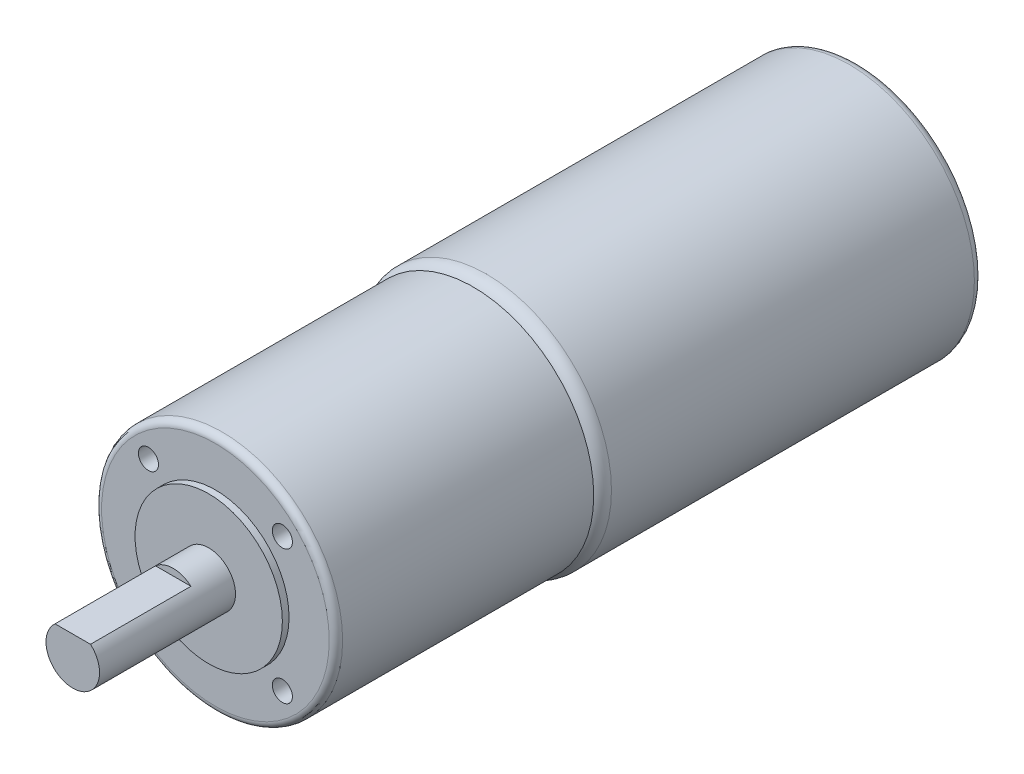
ISO-10303-21;
HEADER;
FILE_DESCRIPTION(('STEP AP214'),'2;1');
FILE_NAME('part.step','',(''),(''),'','','');
FILE_SCHEMA(('AUTOMOTIVE_DESIGN { 1 0 10303 214 1 1 1 1 }'));
ENDSEC;
DATA;
#1=APPLICATION_CONTEXT('core data for automotive mechanical design processes');
#2=APPLICATION_PROTOCOL_DEFINITION('international standard','automotive_design',2000,#1);
#3=PRODUCT_CONTEXT('',#1,'mechanical');
#4=PRODUCT('Part','Part','',(#3));
#5=PRODUCT_RELATED_PRODUCT_CATEGORY('part','',(#4));
#6=PRODUCT_DEFINITION_FORMATION('','',#4);
#7=PRODUCT_DEFINITION_CONTEXT('part definition',#1,'design');
#8=PRODUCT_DEFINITION('design','',#6,#7);
#9=PRODUCT_DEFINITION_SHAPE('','',#8);
#10=(LENGTH_UNIT() NAMED_UNIT(*) SI_UNIT(.MILLI.,.METRE.));
#11=(NAMED_UNIT(*) PLANE_ANGLE_UNIT() SI_UNIT($,.RADIAN.));
#12=(NAMED_UNIT(*) SI_UNIT($,.STERADIAN.) SOLID_ANGLE_UNIT());
#13=UNCERTAINTY_MEASURE_WITH_UNIT(LENGTH_MEASURE(1.E-05),#10,'distance_accuracy_value','');
#14=(GEOMETRIC_REPRESENTATION_CONTEXT(3) GLOBAL_UNCERTAINTY_ASSIGNED_CONTEXT((#13)) GLOBAL_UNIT_ASSIGNED_CONTEXT((#10,
#11,#12)) REPRESENTATION_CONTEXT('',''));
#15=CARTESIAN_POINT('',(0.,0.,0.));
#16=DIRECTION('',(0.,0.,1.));
#17=DIRECTION('',(1.,0.,0.));
#18=AXIS2_PLACEMENT_3D('',#15,#16,#17);
#19=CARTESIAN_POINT('',(0.,0.,38.5));
#20=DIRECTION('',(0.,0.,1.));
#21=DIRECTION('',(1.,0.,0.));
#22=AXIS2_PLACEMENT_3D('',#19,#20,#21);
#23=PLANE('',#22);
#24=CARTESIAN_POINT('',(0.,0.,38.5));
#25=DIRECTION('',(0.,0.,1.));
#26=DIRECTION('',(1.,0.,0.));
#27=AXIS2_PLACEMENT_3D('',#24,#25,#26);
#28=CIRCLE('',#27,11.);
#29=CARTESIAN_POINT('',(11.,0.,38.5));
#30=VERTEX_POINT('',#29);
#31=EDGE_CURVE('E388',#30,#30,#28,.T.);
#32=ORIENTED_EDGE('',*,*,#31,.F.);
#33=EDGE_LOOP('',(#32));
#34=FACE_BOUND('',#33,.T.);
#35=CARTESIAN_POINT('',(0.,0.,38.5));
#36=DIRECTION('',(0.,0.,1.));
#37=DIRECTION('',(1.,0.,0.));
#38=AXIS2_PLACEMENT_3D('',#35,#36,#37);
#39=CIRCLE('',#38,17.);
#40=CARTESIAN_POINT('',(17.,0.,38.5));
#41=VERTEX_POINT('',#40);
#42=EDGE_CURVE('E51',#41,#41,#39,.T.);
#43=ORIENTED_EDGE('',*,*,#42,.T.);
#44=EDGE_LOOP('',(#43));
#45=FACE_BOUND('',#44,.T.);
#46=CARTESIAN_POINT('',(10.,-10.,38.5));
#47=DIRECTION('',(0.,0.,1.));
#48=DIRECTION('',(1.,0.,0.));
#49=AXIS2_PLACEMENT_3D('',#46,#47,#48);
#50=CIRCLE('',#49,1.5);
#51=CARTESIAN_POINT('',(11.5,-10.,38.5));
#52=VERTEX_POINT('',#51);
#53=EDGE_CURVE('E113',#52,#52,#50,.T.);
#54=ORIENTED_EDGE('',*,*,#53,.F.);
#55=EDGE_LOOP('',(#54));
#56=FACE_BOUND('',#55,.T.);
#57=CARTESIAN_POINT('',(-10.,10.,38.5));
#58=DIRECTION('',(0.,0.,1.));
#59=DIRECTION('',(1.,0.,0.));
#60=AXIS2_PLACEMENT_3D('',#57,#58,#59);
#61=CIRCLE('',#60,1.5);
#62=CARTESIAN_POINT('',(-8.5,10.,38.5));
#63=VERTEX_POINT('',#62);
#64=EDGE_CURVE('E129',#63,#63,#61,.T.);
#65=ORIENTED_EDGE('',*,*,#64,.F.);
#66=EDGE_LOOP('',(#65));
#67=FACE_BOUND('',#66,.T.);
#68=CARTESIAN_POINT('',(10.,10.,38.5));
#69=DIRECTION('',(0.,0.,1.));
#70=DIRECTION('',(1.,0.,0.));
#71=AXIS2_PLACEMENT_3D('',#68,#69,#70);
#72=CIRCLE('',#71,1.5);
#73=CARTESIAN_POINT('',(11.5,10.,38.5));
#74=VERTEX_POINT('',#73);
#75=EDGE_CURVE('E121',#74,#74,#72,.T.);
#76=ORIENTED_EDGE('',*,*,#75,.F.);
#77=EDGE_LOOP('',(#76));
#78=FACE_BOUND('',#77,.T.);
#79=CARTESIAN_POINT('',(-9.99999999999999,-10.,38.5));
#80=DIRECTION('',(0.,0.,1.));
#81=DIRECTION('',(1.,0.,0.));
#82=AXIS2_PLACEMENT_3D('',#79,#80,#81);
#83=CIRCLE('',#82,1.5);
#84=CARTESIAN_POINT('',(-8.49999999999999,-10.,38.5));
#85=VERTEX_POINT('',#84);
#86=EDGE_CURVE('E105',#85,#85,#83,.T.);
#87=ORIENTED_EDGE('',*,*,#86,.F.);
#88=EDGE_LOOP('',(#87));
#89=FACE_BOUND('',#88,.T.);
#90=ADVANCED_FACE('F41',(#34,#45,#56,#67,#78,#89),#23,.T.);
#91=CARTESIAN_POINT('',(0.,0.,0.));
#92=DIRECTION('',(0.,0.,1.));
#93=DIRECTION('',(1.,0.,0.));
#94=AXIS2_PLACEMENT_3D('',#91,#92,#93);
#95=PLANE('',#94);
#96=CARTESIAN_POINT('',(0.,0.,0.));
#97=DIRECTION('',(0.,0.,1.));
#98=DIRECTION('',(1.,0.,0.));
#99=AXIS2_PLACEMENT_3D('',#96,#97,#98);
#100=CIRCLE('',#99,16.65);
#101=CARTESIAN_POINT('',(16.65,0.,0.));
#102=VERTEX_POINT('',#101);
#103=EDGE_CURVE('E100',#102,#102,#100,.T.);
#104=ORIENTED_EDGE('',*,*,#103,.T.);
#105=EDGE_LOOP('',(#104));
#106=FACE_BOUND('',#105,.T.);
#107=CARTESIAN_POINT('',(0.,0.,0.));
#108=DIRECTION('',(0.,0.,1.));
#109=DIRECTION('',(1.,0.,0.));
#110=AXIS2_PLACEMENT_3D('',#107,#108,#109);
#111=CIRCLE('',#110,18.);
#112=CARTESIAN_POINT('',(18.,0.,0.));
#113=VERTEX_POINT('',#112);
#114=EDGE_CURVE('E133',#113,#113,#111,.T.);
#115=ORIENTED_EDGE('',*,*,#114,.F.);
#116=EDGE_LOOP('',(#115));
#117=FACE_BOUND('',#116,.T.);
#118=ADVANCED_FACE('F163',(#106,#117),#95,.F.);
#119=CARTESIAN_POINT('',(0.,0.,38.5));
#120=DIRECTION('',(0.,0.,-1.));
#121=DIRECTION('',(-1.,0.,0.));
#122=AXIS2_PLACEMENT_3D('',#119,#120,#121);
#123=CYLINDRICAL_SURFACE('',#122,18.);
#124=CARTESIAN_POINT('',(0.,0.,37.5));
#125=DIRECTION('',(0.,0.,1.));
#126=DIRECTION('',(1.,0.,0.));
#127=AXIS2_PLACEMENT_3D('',#124,#125,#126);
#128=CIRCLE('',#127,18.);
#129=CARTESIAN_POINT('',(18.,0.,37.5));
#130=VERTEX_POINT('',#129);
#131=EDGE_CURVE('E11',#130,#130,#128,.F.);
#132=ORIENTED_EDGE('',*,*,#131,.T.);
#133=EDGE_LOOP('',(#132));
#134=FACE_BOUND('',#133,.T.);
#135=ORIENTED_EDGE('',*,*,#114,.T.);
#136=EDGE_LOOP('',(#135));
#137=FACE_BOUND('',#136,.T.);
#138=ADVANCED_FACE('F170',(#134,#137),#123,.T.);
#139=CARTESIAN_POINT('',(-10.,10.,38.5));
#140=DIRECTION('',(0.,0.,-1.));
#141=DIRECTION('',(-1.,0.,0.));
#142=AXIS2_PLACEMENT_3D('',#139,#140,#141);
#143=CYLINDRICAL_SURFACE('',#142,1.5);
#144=ORIENTED_EDGE('',*,*,#64,.T.);
#145=EDGE_LOOP('',(#144));
#146=FACE_BOUND('',#145,.T.);
#147=CARTESIAN_POINT('',(-10.,10.,0.));
#148=DIRECTION('',(0.,0.,1.));
#149=DIRECTION('',(1.,0.,0.));
#150=AXIS2_PLACEMENT_3D('',#147,#148,#149);
#151=CIRCLE('',#150,1.5);
#152=CARTESIAN_POINT('',(-8.5,10.,0.));
#153=VERTEX_POINT('',#152);
#154=EDGE_CURVE('E125',#153,#153,#151,.T.);
#155=ORIENTED_EDGE('',*,*,#154,.F.);
#156=EDGE_LOOP('',(#155));
#157=FACE_BOUND('',#156,.T.);
#158=ADVANCED_FACE('F175',(#146,#157),#143,.F.);
#159=CARTESIAN_POINT('',(10.,10.,38.5));
#160=DIRECTION('',(0.,0.,-1.));
#161=DIRECTION('',(-1.,0.,0.));
#162=AXIS2_PLACEMENT_3D('',#159,#160,#161);
#163=CYLINDRICAL_SURFACE('',#162,1.5);
#164=ORIENTED_EDGE('',*,*,#75,.T.);
#165=EDGE_LOOP('',(#164));
#166=FACE_BOUND('',#165,.T.);
#167=CARTESIAN_POINT('',(10.,10.,0.));
#168=DIRECTION('',(0.,0.,1.));
#169=DIRECTION('',(1.,0.,0.));
#170=AXIS2_PLACEMENT_3D('',#167,#168,#169);
#171=CIRCLE('',#170,1.5);
#172=CARTESIAN_POINT('',(11.5,10.,0.));
#173=VERTEX_POINT('',#172);
#174=EDGE_CURVE('E117',#173,#173,#171,.T.);
#175=ORIENTED_EDGE('',*,*,#174,.F.);
#176=EDGE_LOOP('',(#175));
#177=FACE_BOUND('',#176,.T.);
#178=ADVANCED_FACE('F182',(#166,#177),#163,.F.);
#179=CARTESIAN_POINT('',(10.,-10.,38.5));
#180=DIRECTION('',(0.,0.,-1.));
#181=DIRECTION('',(-1.,0.,0.));
#182=AXIS2_PLACEMENT_3D('',#179,#180,#181);
#183=CYLINDRICAL_SURFACE('',#182,1.5);
#184=ORIENTED_EDGE('',*,*,#53,.T.);
#185=EDGE_LOOP('',(#184));
#186=FACE_BOUND('',#185,.T.);
#187=CARTESIAN_POINT('',(10.,-10.,0.));
#188=DIRECTION('',(0.,0.,1.));
#189=DIRECTION('',(1.,0.,0.));
#190=AXIS2_PLACEMENT_3D('',#187,#188,#189);
#191=CIRCLE('',#190,1.5);
#192=CARTESIAN_POINT('',(11.5,-10.,0.));
#193=VERTEX_POINT('',#192);
#194=EDGE_CURVE('E109',#193,#193,#191,.T.);
#195=ORIENTED_EDGE('',*,*,#194,.F.);
#196=EDGE_LOOP('',(#195));
#197=FACE_BOUND('',#196,.T.);
#198=ADVANCED_FACE('F190',(#186,#197),#183,.F.);
#199=CARTESIAN_POINT('',(-9.99999999999999,-10.,38.5));
#200=DIRECTION('',(0.,0.,-1.));
#201=DIRECTION('',(-1.,0.,0.));
#202=AXIS2_PLACEMENT_3D('',#199,#200,#201);
#203=CYLINDRICAL_SURFACE('',#202,1.5);
#204=ORIENTED_EDGE('',*,*,#86,.T.);
#205=EDGE_LOOP('',(#204));
#206=FACE_BOUND('',#205,.T.);
#207=CARTESIAN_POINT('',(-9.99999999999999,-10.,0.));
#208=DIRECTION('',(0.,0.,1.));
#209=DIRECTION('',(1.,0.,0.));
#210=AXIS2_PLACEMENT_3D('',#207,#208,#209);
#211=CIRCLE('',#210,1.5);
#212=CARTESIAN_POINT('',(-8.49999999999999,-10.,0.));
#213=VERTEX_POINT('',#212);
#214=EDGE_CURVE('E104',#213,#213,#211,.T.);
#215=ORIENTED_EDGE('',*,*,#214,.F.);
#216=EDGE_LOOP('',(#215));
#217=FACE_BOUND('',#216,.T.);
#218=ADVANCED_FACE('F213',(#206,#217),#203,.F.);
#219=CARTESIAN_POINT('',(0.,0.,0.));
#220=DIRECTION('',(0.,0.,1.));
#221=DIRECTION('',(1.,0.,0.));
#222=AXIS2_PLACEMENT_3D('',#219,#220,#221);
#223=PLANE('',#222);
#224=ORIENTED_EDGE('',*,*,#214,.T.);
#225=EDGE_LOOP('',(#224));
#226=FACE_BOUND('',#225,.T.);
#227=ADVANCED_FACE('F201',(#226),#223,.T.);
#228=ORIENTED_EDGE('',*,*,#194,.T.);
#229=EDGE_LOOP('',(#228));
#230=FACE_BOUND('',#229,.T.);
#231=ADVANCED_FACE('F209',(#230),#223,.T.);
#232=ORIENTED_EDGE('',*,*,#174,.T.);
#233=EDGE_LOOP('',(#232));
#234=FACE_BOUND('',#233,.T.);
#235=ADVANCED_FACE('F199',(#234),#223,.T.);
#236=ORIENTED_EDGE('',*,*,#154,.T.);
#237=EDGE_LOOP('',(#236));
#238=FACE_BOUND('',#237,.T.);
#239=ADVANCED_FACE('F196',(#238),#223,.T.);
#240=CARTESIAN_POINT('',(0.,0.,-2.));
#241=DIRECTION('',(0.,0.,1.));
#242=DIRECTION('',(1.,0.,0.));
#243=AXIS2_PLACEMENT_3D('',#240,#241,#242);
#244=TOROIDAL_SURFACE('',#243,16.65,2.);
#245=CARTESIAN_POINT('',(0.,0.,-2.));
#246=DIRECTION('',(0.,0.,1.));
#247=DIRECTION('',(1.,0.,0.));
#248=AXIS2_PLACEMENT_3D('',#245,#246,#247);
#249=CIRCLE('',#248,18.65);
#250=CARTESIAN_POINT('',(18.65,0.,-2.));
#251=VERTEX_POINT('',#250);
#252=EDGE_CURVE('E96',#251,#251,#249,.T.);
#253=ORIENTED_EDGE('',*,*,#252,.T.);
#254=EDGE_LOOP('',(#253));
#255=FACE_BOUND('',#254,.T.);
#256=ORIENTED_EDGE('',*,*,#103,.F.);
#257=EDGE_LOOP('',(#256));
#258=FACE_BOUND('',#257,.T.);
#259=ADVANCED_FACE('F198',(#255,#258),#244,.T.);
#260=CARTESIAN_POINT('',(0.,0.,1000.));
#261=DIRECTION('',(0.,0.,1.));
#262=DIRECTION('',(1.,0.,0.));
#263=AXIS2_PLACEMENT_3D('',#260,#261,#262);
#264=CYLINDRICAL_SURFACE('',#263,18.65);
#265=CARTESIAN_POINT('',(0.,0.,-56.2));
#266=DIRECTION('',(0.,0.,1.));
#267=DIRECTION('',(1.,0.,0.));
#268=AXIS2_PLACEMENT_3D('',#265,#266,#267);
#269=CIRCLE('',#268,18.65);
#270=CARTESIAN_POINT('',(18.65,0.,-56.2));
#271=VERTEX_POINT('',#270);
#272=EDGE_CURVE('E89',#271,#271,#269,.T.);
#273=ORIENTED_EDGE('',*,*,#272,.T.);
#274=EDGE_LOOP('',(#273));
#275=FACE_BOUND('',#274,.T.);
#276=ORIENTED_EDGE('',*,*,#252,.F.);
#277=EDGE_LOOP('',(#276));
#278=FACE_BOUND('',#277,.T.);
#279=ADVANCED_FACE('F206',(#275,#278),#264,.T.);
#280=CARTESIAN_POINT('',(0.,0.,-56.2));
#281=DIRECTION('',(0.,0.,1.));
#282=DIRECTION('',(1.,0.,0.));
#283=AXIS2_PLACEMENT_3D('',#280,#281,#282);
#284=TOROIDAL_SURFACE('',#283,17.35,1.3);
#285=CARTESIAN_POINT('',(0.,0.,-57.5000000000001));
#286=DIRECTION('',(0.,0.,1.));
#287=DIRECTION('',(1.,0.,0.));
#288=AXIS2_PLACEMENT_3D('',#285,#286,#287);
#289=CIRCLE('',#288,17.35);
#290=CARTESIAN_POINT('',(17.35,0.,-57.5000000000001));
#291=VERTEX_POINT('',#290);
#292=EDGE_CURVE('E85',#291,#291,#289,.T.);
#293=ORIENTED_EDGE('',*,*,#292,.T.);
#294=EDGE_LOOP('',(#293));
#295=FACE_BOUND('',#294,.T.);
#296=ORIENTED_EDGE('',*,*,#272,.F.);
#297=EDGE_LOOP('',(#296));
#298=FACE_BOUND('',#297,.T.);
#299=ADVANCED_FACE('F158',(#295,#298),#284,.T.);
#300=CARTESIAN_POINT('',(0.,0.,-57.5));
#301=DIRECTION('',(0.,0.,1.));
#302=DIRECTION('',(1.,0.,0.));
#303=AXIS2_PLACEMENT_3D('',#300,#301,#302);
#304=PLANE('',#303);
#305=ORIENTED_EDGE('',*,*,#292,.F.);
#306=EDGE_LOOP('',(#305));
#307=FACE_BOUND('',#306,.T.);
#308=ADVANCED_FACE('F148',(#307),#304,.F.);
#309=CARTESIAN_POINT('',(0.,0.,37.5));
#310=DIRECTION('',(0.,0.,1.));
#311=DIRECTION('',(1.,0.,0.));
#312=AXIS2_PLACEMENT_3D('',#309,#310,#311);
#313=TOROIDAL_SURFACE('',#312,17.,1.);
#314=ORIENTED_EDGE('',*,*,#131,.F.);
#315=EDGE_LOOP('',(#314));
#316=FACE_BOUND('',#315,.T.);
#317=ORIENTED_EDGE('',*,*,#42,.F.);
#318=EDGE_LOOP('',(#317));
#319=FACE_BOUND('',#318,.T.);
#320=ADVANCED_FACE('F43',(#316,#319),#313,.T.);
#321=CARTESIAN_POINT('',(0.,0.,39.5));
#322=DIRECTION('',(0.,0.,-1.));
#323=DIRECTION('',(-1.,0.,0.));
#324=AXIS2_PLACEMENT_3D('',#321,#322,#323);
#325=CYLINDRICAL_SURFACE('',#324,11.);
#326=CARTESIAN_POINT('',(0.,0.,39.5));
#327=DIRECTION('',(0.,0.,1.));
#328=DIRECTION('',(1.,0.,0.));
#329=AXIS2_PLACEMENT_3D('',#326,#327,#328);
#330=CIRCLE('',#329,11.);
#331=CARTESIAN_POINT('',(11.,0.,39.5));
#332=VERTEX_POINT('',#331);
#333=EDGE_CURVE('E385',#332,#332,#330,.T.);
#334=ORIENTED_EDGE('',*,*,#333,.F.);
#335=EDGE_LOOP('',(#334));
#336=FACE_BOUND('',#335,.T.);
#337=ORIENTED_EDGE('',*,*,#31,.T.);
#338=EDGE_LOOP('',(#337));
#339=FACE_BOUND('',#338,.T.);
#340=ADVANCED_FACE('F147',(#336,#339),#325,.T.);
#341=CARTESIAN_POINT('',(0.,0.,39.5));
#342=DIRECTION('',(0.,0.,1.));
#343=DIRECTION('',(1.,0.,0.));
#344=AXIS2_PLACEMENT_3D('',#341,#342,#343);
#345=PLANE('',#344);
#346=CARTESIAN_POINT('',(0.,0.,39.5));
#347=DIRECTION('',(0.,0.,1.));
#348=DIRECTION('',(1.,0.,0.));
#349=AXIS2_PLACEMENT_3D('',#346,#347,#348);
#350=CIRCLE('',#349,4.);
#351=CARTESIAN_POINT('',(4.,0.,39.5));
#352=VERTEX_POINT('',#351);
#353=EDGE_CURVE('E45',#352,#352,#350,.T.);
#354=ORIENTED_EDGE('',*,*,#353,.F.);
#355=EDGE_LOOP('',(#354));
#356=FACE_BOUND('',#355,.T.);
#357=ORIENTED_EDGE('',*,*,#333,.T.);
#358=EDGE_LOOP('',(#357));
#359=FACE_BOUND('',#358,.T.);
#360=ADVANCED_FACE('F154',(#356,#359),#345,.T.);
#361=CARTESIAN_POINT('',(0.,0.,44.8));
#362=DIRECTION('',(0.,0.,1.));
#363=DIRECTION('',(1.,0.,0.));
#364=AXIS2_PLACEMENT_3D('',#361,#362,#363);
#365=PLANE('',#364);
#366=CARTESIAN_POINT('',(0.,0.,44.8));
#367=DIRECTION('',(0.,0.,1.));
#368=DIRECTION('',(1.,0.,0.));
#369=AXIS2_PLACEMENT_3D('',#366,#367,#368);
#370=CIRCLE('',#369,4.);
#371=CARTESIAN_POINT('',(2.64575131106459,3.,44.8));
#372=VERTEX_POINT('',#371);
#373=CARTESIAN_POINT('',(-2.64575131106459,3.,44.8));
#374=VERTEX_POINT('',#373);
#375=EDGE_CURVE('E75',#372,#374,#370,.T.);
#376=ORIENTED_EDGE('',*,*,#375,.T.);
#377=DIRECTION('',(1.,0.,0.));
#378=VECTOR('',#377,1.);
#379=CARTESIAN_POINT('',(0.,3.,44.8));
#380=LINE('',#379,#378);
#381=EDGE_CURVE('E398',#374,#372,#380,.T.);
#382=ORIENTED_EDGE('',*,*,#381,.T.);
#383=EDGE_LOOP('',(#376,#382));
#384=FACE_BOUND('',#383,.T.);
#385=ADVANCED_FACE('F339',(#384),#365,.T.);
#386=CARTESIAN_POINT('',(0.,3.,44.8));
#387=DIRECTION('',(0.,-1.,0.));
#388=DIRECTION('',(0.,0.,-1.));
#389=AXIS2_PLACEMENT_3D('',#386,#387,#388);
#390=PLANE('',#389);
#391=DIRECTION('',(1.,0.,0.));
#392=VECTOR('',#391,1.);
#393=CARTESIAN_POINT('',(0.,3.,59.8));
#394=LINE('',#393,#392);
#395=CARTESIAN_POINT('',(-2.64575131106459,3.,59.8));
#396=VERTEX_POINT('',#395);
#397=CARTESIAN_POINT('',(2.64575131106459,3.,59.8));
#398=VERTEX_POINT('',#397);
#399=EDGE_CURVE('E69',#396,#398,#394,.T.);
#400=ORIENTED_EDGE('',*,*,#399,.T.);
#401=DIRECTION('',(0.,0.,1.));
#402=VECTOR('',#401,1.);
#403=CARTESIAN_POINT('',(2.64575131106459,3.,44.8));
#404=LINE('',#403,#402);
#405=EDGE_CURVE('E64',#372,#398,#404,.T.);
#406=ORIENTED_EDGE('',*,*,#405,.F.);
#407=ORIENTED_EDGE('',*,*,#381,.F.);
#408=DIRECTION('',(0.,0.,1.));
#409=VECTOR('',#408,1.);
#410=CARTESIAN_POINT('',(-2.64575131106459,3.,44.8));
#411=LINE('',#410,#409);
#412=EDGE_CURVE('E58',#374,#396,#411,.T.);
#413=ORIENTED_EDGE('',*,*,#412,.T.);
#414=EDGE_LOOP('',(#400,#406,#407,#413));
#415=FACE_BOUND('',#414,.T.);
#416=ADVANCED_FACE('F70',(#415),#390,.F.);
#417=CARTESIAN_POINT('',(0.,0.,59.8));
#418=DIRECTION('',(0.,0.,1.));
#419=DIRECTION('',(1.,0.,0.));
#420=AXIS2_PLACEMENT_3D('',#417,#418,#419);
#421=PLANE('',#420);
#422=ORIENTED_EDGE('',*,*,#399,.F.);
#423=CARTESIAN_POINT('',(0.,0.,59.8));
#424=DIRECTION('',(0.,0.,1.));
#425=DIRECTION('',(1.,0.,0.));
#426=AXIS2_PLACEMENT_3D('',#423,#424,#425);
#427=CIRCLE('',#426,4.);
#428=EDGE_CURVE('E80',#396,#398,#427,.T.);
#429=ORIENTED_EDGE('',*,*,#428,.T.);
#430=EDGE_LOOP('',(#422,#429));
#431=FACE_BOUND('',#430,.T.);
#432=ADVANCED_FACE('F83',(#431),#421,.T.);
#433=CARTESIAN_POINT('',(0.,0.,59.8));
#434=DIRECTION('',(0.,0.,-1.));
#435=DIRECTION('',(-1.,0.,0.));
#436=AXIS2_PLACEMENT_3D('',#433,#434,#435);
#437=CYLINDRICAL_SURFACE('',#436,4.);
#438=ORIENTED_EDGE('',*,*,#353,.T.);
#439=EDGE_LOOP('',(#438));
#440=FACE_BOUND('',#439,.T.);
#441=ORIENTED_EDGE('',*,*,#428,.F.);
#442=ORIENTED_EDGE('',*,*,#412,.F.);
#443=ORIENTED_EDGE('',*,*,#375,.F.);
#444=ORIENTED_EDGE('',*,*,#405,.T.);
#445=EDGE_LOOP('',(#441,#442,#443,#444));
#446=FACE_BOUND('',#445,.T.);
#447=ADVANCED_FACE('F79',(#440,#446),#437,.T.);
#448=CLOSED_SHELL('',(#90,#118,#138,#158,#178,#198,#218,#227,#231,#235,#239,#259,#279,#299,#308,
#320,#340,#360,#385,#416,#432,#447));
#449=MANIFOLD_SOLID_BREP('B2',#448);
#450=ADVANCED_BREP_SHAPE_REPRESENTATION('',(#18,#449),#14);
#451=SHAPE_DEFINITION_REPRESENTATION(#9,#450);
ENDSEC;
END-ISO-10303-21;
